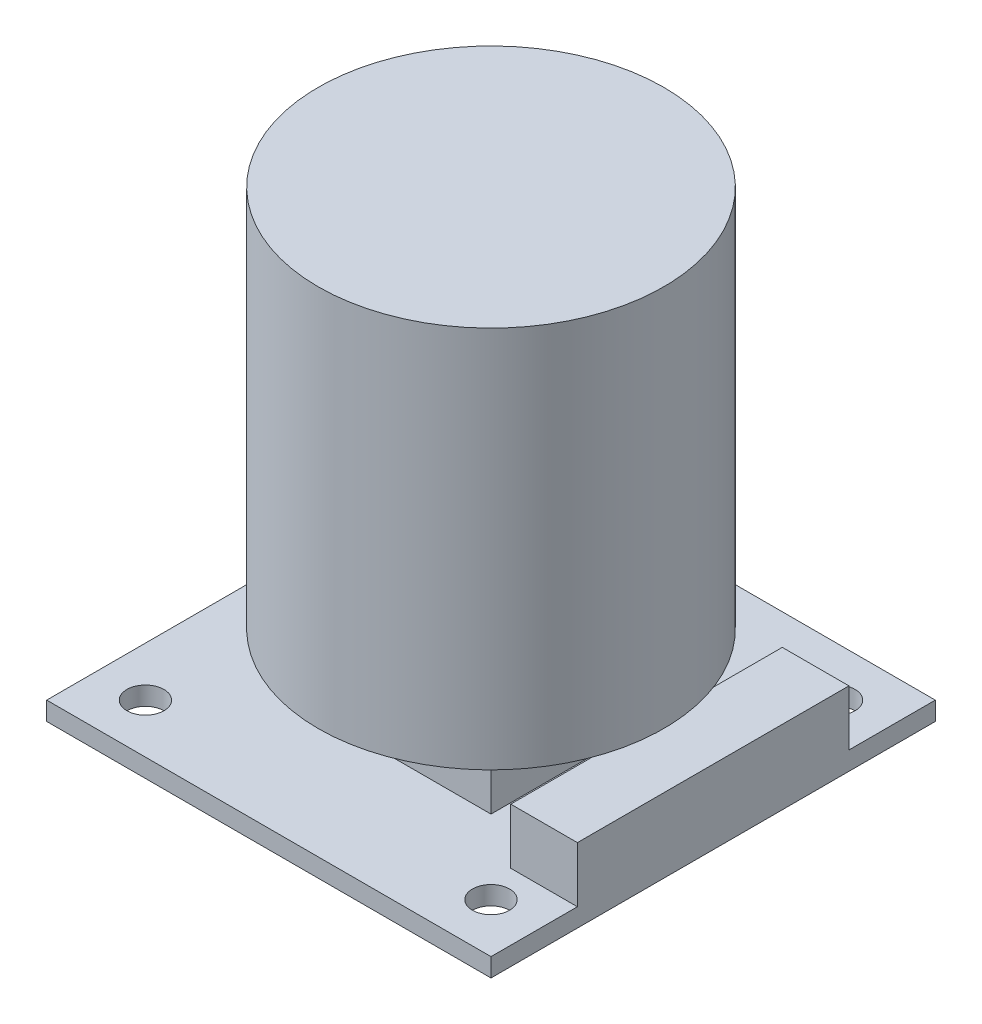
ISO-10303-21;
HEADER;
FILE_DESCRIPTION(('STEP AP214'),'2;1');
FILE_NAME('part.step','',(''),(''),'','','');
FILE_SCHEMA(('AUTOMOTIVE_DESIGN { 1 0 10303 214 1 1 1 1 }'));
ENDSEC;
DATA;
#1=APPLICATION_CONTEXT('core data for automotive mechanical design processes');
#2=APPLICATION_PROTOCOL_DEFINITION('international standard','automotive_design',2000,#1);
#3=PRODUCT_CONTEXT('',#1,'mechanical');
#4=PRODUCT('Part','Part','',(#3));
#5=PRODUCT_RELATED_PRODUCT_CATEGORY('part','',(#4));
#6=PRODUCT_DEFINITION_FORMATION('','',#4);
#7=PRODUCT_DEFINITION_CONTEXT('part definition',#1,'design');
#8=PRODUCT_DEFINITION('design','',#6,#7);
#9=PRODUCT_DEFINITION_SHAPE('','',#8);
#10=(LENGTH_UNIT() NAMED_UNIT(*) SI_UNIT(.MILLI.,.METRE.));
#11=(NAMED_UNIT(*) PLANE_ANGLE_UNIT() SI_UNIT($,.RADIAN.));
#12=(NAMED_UNIT(*) SI_UNIT($,.STERADIAN.) SOLID_ANGLE_UNIT());
#13=UNCERTAINTY_MEASURE_WITH_UNIT(LENGTH_MEASURE(1.E-05),#10,'distance_accuracy_value','');
#14=(GEOMETRIC_REPRESENTATION_CONTEXT(3) GLOBAL_UNCERTAINTY_ASSIGNED_CONTEXT((#13)) GLOBAL_UNIT_ASSIGNED_CONTEXT((#10,
#11,#12)) REPRESENTATION_CONTEXT('',''));
#15=CARTESIAN_POINT('',(0.,0.,0.));
#16=DIRECTION('',(0.,0.,1.));
#17=DIRECTION('',(1.,0.,0.));
#18=AXIS2_PLACEMENT_3D('',#15,#16,#17);
#19=CARTESIAN_POINT('',(0.,1.5,0.));
#20=DIRECTION('',(0.,-1.,0.));
#21=DIRECTION('',(0.,0.,-1.));
#22=AXIS2_PLACEMENT_3D('',#19,#20,#21);
#23=PLANE('',#22);
#24=DIRECTION('',(1.,0.,0.));
#25=VECTOR('',#24,1.);
#26=CARTESIAN_POINT('',(12.6,1.5,11.));
#27=LINE('',#26,#25);
#28=CARTESIAN_POINT('',(12.6,1.5,11.));
#29=VERTEX_POINT('',#28);
#30=CARTESIAN_POINT('',(18.,1.5,11.));
#31=VERTEX_POINT('',#30);
#32=EDGE_CURVE('E186',#29,#31,#27,.T.);
#33=ORIENTED_EDGE('',*,*,#32,.F.);
#34=DIRECTION('',(0.,0.,1.));
#35=VECTOR('',#34,1.);
#36=CARTESIAN_POINT('',(12.6,1.5,11.));
#37=LINE('',#36,#35);
#38=CARTESIAN_POINT('',(12.6,1.5,-11.));
#39=VERTEX_POINT('',#38);
#40=EDGE_CURVE('E199',#39,#29,#37,.T.);
#41=ORIENTED_EDGE('',*,*,#40,.F.);
#42=DIRECTION('',(-1.,0.,0.));
#43=VECTOR('',#42,1.);
#44=CARTESIAN_POINT('',(12.6,1.5,-11.));
#45=LINE('',#44,#43);
#46=CARTESIAN_POINT('',(18.,1.5,-11.));
#47=VERTEX_POINT('',#46);
#48=EDGE_CURVE('E180',#47,#39,#45,.T.);
#49=ORIENTED_EDGE('',*,*,#48,.F.);
#50=DIRECTION('',(0.,0.,-1.));
#51=VECTOR('',#50,1.);
#52=CARTESIAN_POINT('',(18.,1.5,18.));
#53=LINE('',#52,#51);
#54=CARTESIAN_POINT('',(18.,1.5,-18.));
#55=VERTEX_POINT('',#54);
#56=EDGE_CURVE('E258',#47,#55,#53,.T.);
#57=ORIENTED_EDGE('',*,*,#56,.T.);
#58=DIRECTION('',(-1.,0.,0.));
#59=VECTOR('',#58,1.);
#60=CARTESIAN_POINT('',(-18.,1.5,-18.));
#61=LINE('',#60,#59);
#62=CARTESIAN_POINT('',(-18.,1.5,-18.));
#63=VERTEX_POINT('',#62);
#64=EDGE_CURVE('E257',#55,#63,#61,.T.);
#65=ORIENTED_EDGE('',*,*,#64,.T.);
#66=DIRECTION('',(0.,0.,1.));
#67=VECTOR('',#66,1.);
#68=CARTESIAN_POINT('',(-18.,1.5,18.));
#69=LINE('',#68,#67);
#70=CARTESIAN_POINT('',(-18.,1.5,18.));
#71=VERTEX_POINT('',#70);
#72=EDGE_CURVE('E261',#63,#71,#69,.T.);
#73=ORIENTED_EDGE('',*,*,#72,.T.);
#74=DIRECTION('',(1.,0.,0.));
#75=VECTOR('',#74,1.);
#76=CARTESIAN_POINT('',(-18.,1.5,18.));
#77=LINE('',#76,#75);
#78=CARTESIAN_POINT('',(18.,1.5,18.));
#79=VERTEX_POINT('',#78);
#80=EDGE_CURVE('E264',#71,#79,#77,.T.);
#81=ORIENTED_EDGE('',*,*,#80,.T.);
#82=EDGE_CURVE('E254',#79,#31,#53,.T.);
#83=ORIENTED_EDGE('',*,*,#82,.T.);
#84=EDGE_LOOP('',(#33,#41,#49,#57,#65,#73,#81,#83));
#85=FACE_BOUND('',#84,.T.);
#86=CARTESIAN_POINT('',(-14.,1.5,-14.));
#87=DIRECTION('',(0.,1.,0.));
#88=DIRECTION('',(0.,0.,1.));
#89=AXIS2_PLACEMENT_3D('',#86,#87,#88);
#90=CIRCLE('',#89,1.5);
#91=CARTESIAN_POINT('',(-14.,1.5,-12.5));
#92=VERTEX_POINT('',#91);
#93=EDGE_CURVE('E221',#92,#92,#90,.T.);
#94=ORIENTED_EDGE('',*,*,#93,.F.);
#95=EDGE_LOOP('',(#94));
#96=FACE_BOUND('',#95,.T.);
#97=CARTESIAN_POINT('',(-14.,1.5,14.));
#98=DIRECTION('',(0.,1.,0.));
#99=DIRECTION('',(0.,0.,1.));
#100=AXIS2_PLACEMENT_3D('',#97,#98,#99);
#101=CIRCLE('',#100,1.5);
#102=CARTESIAN_POINT('',(-14.,1.5,15.5));
#103=VERTEX_POINT('',#102);
#104=EDGE_CURVE('E235',#103,#103,#101,.T.);
#105=ORIENTED_EDGE('',*,*,#104,.F.);
#106=EDGE_LOOP('',(#105));
#107=FACE_BOUND('',#106,.T.);
#108=CARTESIAN_POINT('',(14.,1.5,14.));
#109=DIRECTION('',(0.,1.,0.));
#110=DIRECTION('',(0.,0.,1.));
#111=AXIS2_PLACEMENT_3D('',#108,#109,#110);
#112=CIRCLE('',#111,1.5);
#113=CARTESIAN_POINT('',(14.,1.5,15.5));
#114=VERTEX_POINT('',#113);
#115=EDGE_CURVE('E227',#114,#114,#112,.T.);
#116=ORIENTED_EDGE('',*,*,#115,.F.);
#117=EDGE_LOOP('',(#116));
#118=FACE_BOUND('',#117,.T.);
#119=CARTESIAN_POINT('',(14.,1.5,-14.));
#120=DIRECTION('',(0.,1.,0.));
#121=DIRECTION('',(0.,0.,1.));
#122=AXIS2_PLACEMENT_3D('',#119,#120,#121);
#123=CIRCLE('',#122,1.5);
#124=CARTESIAN_POINT('',(14.,1.5,-12.5));
#125=VERTEX_POINT('',#124);
#126=EDGE_CURVE('E226',#125,#125,#123,.T.);
#127=ORIENTED_EDGE('',*,*,#126,.F.);
#128=EDGE_LOOP('',(#127));
#129=FACE_BOUND('',#128,.T.);
#130=DIRECTION('',(0.,0.,1.));
#131=VECTOR('',#130,1.);
#132=CARTESIAN_POINT('',(-8.,1.5,8.));
#133=LINE('',#132,#131);
#134=CARTESIAN_POINT('',(-8.,1.5,-8.));
#135=VERTEX_POINT('',#134);
#136=CARTESIAN_POINT('',(-8.,1.5,8.));
#137=VERTEX_POINT('',#136);
#138=EDGE_CURVE('E162',#135,#137,#133,.T.);
#139=ORIENTED_EDGE('',*,*,#138,.F.);
#140=DIRECTION('',(-1.,0.,0.));
#141=VECTOR('',#140,1.);
#142=CARTESIAN_POINT('',(8.,1.5,-8.));
#143=LINE('',#142,#141);
#144=CARTESIAN_POINT('',(8.,1.5,-8.));
#145=VERTEX_POINT('',#144);
#146=EDGE_CURVE('E141',#145,#135,#143,.T.);
#147=ORIENTED_EDGE('',*,*,#146,.F.);
#148=DIRECTION('',(0.,0.,-1.));
#149=VECTOR('',#148,1.);
#150=CARTESIAN_POINT('',(8.,1.5,8.));
#151=LINE('',#150,#149);
#152=CARTESIAN_POINT('',(8.,1.5,8.));
#153=VERTEX_POINT('',#152);
#154=EDGE_CURVE('E62',#153,#145,#151,.T.);
#155=ORIENTED_EDGE('',*,*,#154,.F.);
#156=DIRECTION('',(1.,0.,0.));
#157=VECTOR('',#156,1.);
#158=CARTESIAN_POINT('',(8.,1.5,8.));
#159=LINE('',#158,#157);
#160=EDGE_CURVE('E57',#137,#153,#159,.T.);
#161=ORIENTED_EDGE('',*,*,#160,.F.);
#162=EDGE_LOOP('',(#139,#147,#155,#161));
#163=FACE_BOUND('',#162,.T.);
#164=ADVANCED_FACE('F41',(#85,#96,#107,#118,#129,#163),#23,.F.);
#165=CARTESIAN_POINT('',(18.,1.5,18.));
#166=DIRECTION('',(-1.,0.,0.));
#167=DIRECTION('',(0.,0.,1.));
#168=AXIS2_PLACEMENT_3D('',#165,#166,#167);
#169=PLANE('',#168);
#170=DIRECTION('',(0.,0.,-1.));
#171=VECTOR('',#170,1.);
#172=CARTESIAN_POINT('',(18.,0.,18.));
#173=LINE('',#172,#171);
#174=CARTESIAN_POINT('',(18.,0.,18.));
#175=VERTEX_POINT('',#174);
#176=CARTESIAN_POINT('',(18.,0.,-18.));
#177=VERTEX_POINT('',#176);
#178=EDGE_CURVE('E250',#175,#177,#173,.T.);
#179=ORIENTED_EDGE('',*,*,#178,.T.);
#180=DIRECTION('',(0.,-1.,0.));
#181=VECTOR('',#180,1.);
#182=CARTESIAN_POINT('',(18.,1.5,-18.));
#183=LINE('',#182,#181);
#184=EDGE_CURVE('E11',#55,#177,#183,.T.);
#185=ORIENTED_EDGE('',*,*,#184,.F.);
#186=ORIENTED_EDGE('',*,*,#56,.F.);
#187=DIRECTION('',(0.,-1.,0.));
#188=VECTOR('',#187,1.);
#189=CARTESIAN_POINT('',(18.,6.,-11.));
#190=LINE('',#189,#188);
#191=CARTESIAN_POINT('',(18.,6.,-11.));
#192=VERTEX_POINT('',#191);
#193=EDGE_CURVE('E217',#192,#47,#190,.T.);
#194=ORIENTED_EDGE('',*,*,#193,.F.);
#195=DIRECTION('',(0.,0.,-1.));
#196=VECTOR('',#195,1.);
#197=CARTESIAN_POINT('',(18.,6.,11.));
#198=LINE('',#197,#196);
#199=CARTESIAN_POINT('',(18.,6.,11.));
#200=VERTEX_POINT('',#199);
#201=EDGE_CURVE('E181',#200,#192,#198,.T.);
#202=ORIENTED_EDGE('',*,*,#201,.F.);
#203=DIRECTION('',(0.,-1.,0.));
#204=VECTOR('',#203,1.);
#205=CARTESIAN_POINT('',(18.,6.,11.));
#206=LINE('',#205,#204);
#207=EDGE_CURVE('E195',#200,#31,#206,.T.);
#208=ORIENTED_EDGE('',*,*,#207,.T.);
#209=ORIENTED_EDGE('',*,*,#82,.F.);
#210=DIRECTION('',(0.,-1.,0.));
#211=VECTOR('',#210,1.);
#212=CARTESIAN_POINT('',(18.,1.5,18.));
#213=LINE('',#212,#211);
#214=EDGE_CURVE('E267',#79,#175,#213,.T.);
#215=ORIENTED_EDGE('',*,*,#214,.T.);
#216=EDGE_LOOP('',(#179,#185,#186,#194,#202,#208,#209,#215));
#217=FACE_BOUND('',#216,.T.);
#218=ADVANCED_FACE('F43',(#217),#169,.F.);
#219=CARTESIAN_POINT('',(-18.,1.5,-18.));
#220=DIRECTION('',(0.,0.,1.));
#221=DIRECTION('',(1.,0.,0.));
#222=AXIS2_PLACEMENT_3D('',#219,#220,#221);
#223=PLANE('',#222);
#224=DIRECTION('',(-1.,0.,0.));
#225=VECTOR('',#224,1.);
#226=CARTESIAN_POINT('',(-18.,0.,-18.));
#227=LINE('',#226,#225);
#228=CARTESIAN_POINT('',(-18.,0.,-18.));
#229=VERTEX_POINT('',#228);
#230=EDGE_CURVE('E271',#177,#229,#227,.T.);
#231=ORIENTED_EDGE('',*,*,#230,.T.);
#232=DIRECTION('',(0.,-1.,0.));
#233=VECTOR('',#232,1.);
#234=CARTESIAN_POINT('',(-18.,1.5,-18.));
#235=LINE('',#234,#233);
#236=EDGE_CURVE('E50',#63,#229,#235,.T.);
#237=ORIENTED_EDGE('',*,*,#236,.F.);
#238=ORIENTED_EDGE('',*,*,#64,.F.);
#239=ORIENTED_EDGE('',*,*,#184,.T.);
#240=EDGE_LOOP('',(#231,#237,#238,#239));
#241=FACE_BOUND('',#240,.T.);
#242=ADVANCED_FACE('F324',(#241),#223,.F.);
#243=CARTESIAN_POINT('',(-18.,1.5,18.));
#244=DIRECTION('',(1.,0.,0.));
#245=DIRECTION('',(0.,0.,-1.));
#246=AXIS2_PLACEMENT_3D('',#243,#244,#245);
#247=PLANE('',#246);
#248=DIRECTION('',(0.,0.,1.));
#249=VECTOR('',#248,1.);
#250=CARTESIAN_POINT('',(-18.,0.,18.));
#251=LINE('',#250,#249);
#252=CARTESIAN_POINT('',(-18.,0.,18.));
#253=VERTEX_POINT('',#252);
#254=EDGE_CURVE('E274',#229,#253,#251,.T.);
#255=ORIENTED_EDGE('',*,*,#254,.T.);
#256=DIRECTION('',(0.,-1.,0.));
#257=VECTOR('',#256,1.);
#258=CARTESIAN_POINT('',(-18.,1.5,18.));
#259=LINE('',#258,#257);
#260=EDGE_CURVE('E283',#71,#253,#259,.T.);
#261=ORIENTED_EDGE('',*,*,#260,.F.);
#262=ORIENTED_EDGE('',*,*,#72,.F.);
#263=ORIENTED_EDGE('',*,*,#236,.T.);
#264=EDGE_LOOP('',(#255,#261,#262,#263));
#265=FACE_BOUND('',#264,.T.);
#266=ADVANCED_FACE('F292',(#265),#247,.F.);
#267=CARTESIAN_POINT('',(-18.,1.5,18.));
#268=DIRECTION('',(0.,0.,-1.));
#269=DIRECTION('',(-1.,0.,0.));
#270=AXIS2_PLACEMENT_3D('',#267,#268,#269);
#271=PLANE('',#270);
#272=DIRECTION('',(1.,0.,0.));
#273=VECTOR('',#272,1.);
#274=CARTESIAN_POINT('',(-18.,0.,18.));
#275=LINE('',#274,#273);
#276=EDGE_CURVE('E277',#253,#175,#275,.T.);
#277=ORIENTED_EDGE('',*,*,#276,.T.);
#278=ORIENTED_EDGE('',*,*,#214,.F.);
#279=ORIENTED_EDGE('',*,*,#80,.F.);
#280=ORIENTED_EDGE('',*,*,#260,.T.);
#281=EDGE_LOOP('',(#277,#278,#279,#280));
#282=FACE_BOUND('',#281,.T.);
#283=ADVANCED_FACE('F302',(#282),#271,.F.);
#284=CARTESIAN_POINT('',(0.,0.,0.));
#285=DIRECTION('',(0.,-1.,0.));
#286=DIRECTION('',(0.,0.,-1.));
#287=AXIS2_PLACEMENT_3D('',#284,#285,#286);
#288=PLANE('',#287);
#289=CARTESIAN_POINT('',(-14.,0.,-14.));
#290=DIRECTION('',(0.,1.,0.));
#291=DIRECTION('',(0.,0.,1.));
#292=AXIS2_PLACEMENT_3D('',#289,#290,#291);
#293=CIRCLE('',#292,1.5);
#294=CARTESIAN_POINT('',(-14.,0.,-12.5));
#295=VERTEX_POINT('',#294);
#296=EDGE_CURVE('E239',#295,#295,#293,.T.);
#297=ORIENTED_EDGE('',*,*,#296,.T.);
#298=EDGE_LOOP('',(#297));
#299=FACE_BOUND('',#298,.T.);
#300=CARTESIAN_POINT('',(-14.,0.,14.));
#301=DIRECTION('',(0.,1.,0.));
#302=DIRECTION('',(0.,0.,1.));
#303=AXIS2_PLACEMENT_3D('',#300,#301,#302);
#304=CIRCLE('',#303,1.5);
#305=CARTESIAN_POINT('',(-14.,0.,15.5));
#306=VERTEX_POINT('',#305);
#307=EDGE_CURVE('E231',#306,#306,#304,.T.);
#308=ORIENTED_EDGE('',*,*,#307,.T.);
#309=EDGE_LOOP('',(#308));
#310=FACE_BOUND('',#309,.T.);
#311=CARTESIAN_POINT('',(14.,0.,14.));
#312=DIRECTION('',(0.,1.,0.));
#313=DIRECTION('',(0.,0.,1.));
#314=AXIS2_PLACEMENT_3D('',#311,#312,#313);
#315=CIRCLE('',#314,1.5);
#316=CARTESIAN_POINT('',(14.,0.,15.5));
#317=VERTEX_POINT('',#316);
#318=EDGE_CURVE('E222',#317,#317,#315,.T.);
#319=ORIENTED_EDGE('',*,*,#318,.T.);
#320=EDGE_LOOP('',(#319));
#321=FACE_BOUND('',#320,.T.);
#322=CARTESIAN_POINT('',(14.,0.,-14.));
#323=DIRECTION('',(0.,1.,0.));
#324=DIRECTION('',(0.,0.,1.));
#325=AXIS2_PLACEMENT_3D('',#322,#323,#324);
#326=CIRCLE('',#325,1.5);
#327=CARTESIAN_POINT('',(14.,0.,-12.5));
#328=VERTEX_POINT('',#327);
#329=EDGE_CURVE('E246',#328,#328,#326,.T.);
#330=ORIENTED_EDGE('',*,*,#329,.T.);
#331=EDGE_LOOP('',(#330));
#332=FACE_BOUND('',#331,.T.);
#333=ORIENTED_EDGE('',*,*,#178,.F.);
#334=ORIENTED_EDGE('',*,*,#276,.F.);
#335=ORIENTED_EDGE('',*,*,#254,.F.);
#336=ORIENTED_EDGE('',*,*,#230,.F.);
#337=EDGE_LOOP('',(#333,#334,#335,#336));
#338=FACE_BOUND('',#337,.T.);
#339=ADVANCED_FACE('F299',(#299,#310,#321,#332,#338),#288,.T.);
#340=CARTESIAN_POINT('',(14.,0.,-14.));
#341=DIRECTION('',(0.,1.,0.));
#342=DIRECTION('',(0.,0.,1.));
#343=AXIS2_PLACEMENT_3D('',#340,#341,#342);
#344=CYLINDRICAL_SURFACE('',#343,1.5);
#345=ORIENTED_EDGE('',*,*,#329,.F.);
#346=EDGE_LOOP('',(#345));
#347=FACE_BOUND('',#346,.T.);
#348=ORIENTED_EDGE('',*,*,#126,.T.);
#349=EDGE_LOOP('',(#348));
#350=FACE_BOUND('',#349,.T.);
#351=ADVANCED_FACE('F337',(#347,#350),#344,.F.);
#352=CARTESIAN_POINT('',(14.,0.,14.));
#353=DIRECTION('',(0.,1.,0.));
#354=DIRECTION('',(0.,0.,1.));
#355=AXIS2_PLACEMENT_3D('',#352,#353,#354);
#356=CYLINDRICAL_SURFACE('',#355,1.5);
#357=ORIENTED_EDGE('',*,*,#318,.F.);
#358=EDGE_LOOP('',(#357));
#359=FACE_BOUND('',#358,.T.);
#360=ORIENTED_EDGE('',*,*,#115,.T.);
#361=EDGE_LOOP('',(#360));
#362=FACE_BOUND('',#361,.T.);
#363=ADVANCED_FACE('F357',(#359,#362),#356,.F.);
#364=CARTESIAN_POINT('',(-14.,0.,14.));
#365=DIRECTION('',(0.,1.,0.));
#366=DIRECTION('',(0.,0.,1.));
#367=AXIS2_PLACEMENT_3D('',#364,#365,#366);
#368=CYLINDRICAL_SURFACE('',#367,1.5);
#369=ORIENTED_EDGE('',*,*,#307,.F.);
#370=EDGE_LOOP('',(#369));
#371=FACE_BOUND('',#370,.T.);
#372=ORIENTED_EDGE('',*,*,#104,.T.);
#373=EDGE_LOOP('',(#372));
#374=FACE_BOUND('',#373,.T.);
#375=ADVANCED_FACE('F364',(#371,#374),#368,.F.);
#376=CARTESIAN_POINT('',(-14.,0.,-14.));
#377=DIRECTION('',(0.,1.,0.));
#378=DIRECTION('',(0.,0.,1.));
#379=AXIS2_PLACEMENT_3D('',#376,#377,#378);
#380=CYLINDRICAL_SURFACE('',#379,1.5);
#381=ORIENTED_EDGE('',*,*,#296,.F.);
#382=EDGE_LOOP('',(#381));
#383=FACE_BOUND('',#382,.T.);
#384=ORIENTED_EDGE('',*,*,#93,.T.);
#385=EDGE_LOOP('',(#384));
#386=FACE_BOUND('',#385,.T.);
#387=ADVANCED_FACE('F372',(#383,#386),#380,.F.);
#388=CARTESIAN_POINT('',(12.6,6.,-11.));
#389=DIRECTION('',(0.,0.,1.));
#390=DIRECTION('',(1.,0.,0.));
#391=AXIS2_PLACEMENT_3D('',#388,#389,#390);
#392=PLANE('',#391);
#393=ORIENTED_EDGE('',*,*,#48,.T.);
#394=DIRECTION('',(0.,-1.,0.));
#395=VECTOR('',#394,1.);
#396=CARTESIAN_POINT('',(12.6,6.,-11.));
#397=LINE('',#396,#395);
#398=CARTESIAN_POINT('',(12.6,6.,-11.));
#399=VERTEX_POINT('',#398);
#400=EDGE_CURVE('E213',#399,#39,#397,.T.);
#401=ORIENTED_EDGE('',*,*,#400,.F.);
#402=DIRECTION('',(-1.,0.,0.));
#403=VECTOR('',#402,1.);
#404=CARTESIAN_POINT('',(12.6,6.,-11.));
#405=LINE('',#404,#403);
#406=EDGE_CURVE('E185',#192,#399,#405,.T.);
#407=ORIENTED_EDGE('',*,*,#406,.F.);
#408=ORIENTED_EDGE('',*,*,#193,.T.);
#409=EDGE_LOOP('',(#393,#401,#407,#408));
#410=FACE_BOUND('',#409,.T.);
#411=ADVANCED_FACE('F321',(#410),#392,.F.);
#412=CARTESIAN_POINT('',(12.6,6.,11.));
#413=DIRECTION('',(1.,0.,0.));
#414=DIRECTION('',(0.,0.,-1.));
#415=AXIS2_PLACEMENT_3D('',#412,#413,#414);
#416=PLANE('',#415);
#417=ORIENTED_EDGE('',*,*,#40,.T.);
#418=DIRECTION('',(0.,-1.,0.));
#419=VECTOR('',#418,1.);
#420=CARTESIAN_POINT('',(12.6,6.,11.));
#421=LINE('',#420,#419);
#422=CARTESIAN_POINT('',(12.6,6.,11.));
#423=VERTEX_POINT('',#422);
#424=EDGE_CURVE('E209',#423,#29,#421,.T.);
#425=ORIENTED_EDGE('',*,*,#424,.F.);
#426=DIRECTION('',(0.,0.,1.));
#427=VECTOR('',#426,1.);
#428=CARTESIAN_POINT('',(12.6,6.,11.));
#429=LINE('',#428,#427);
#430=EDGE_CURVE('E189',#399,#423,#429,.T.);
#431=ORIENTED_EDGE('',*,*,#430,.F.);
#432=ORIENTED_EDGE('',*,*,#400,.T.);
#433=EDGE_LOOP('',(#417,#425,#431,#432));
#434=FACE_BOUND('',#433,.T.);
#435=ADVANCED_FACE('F317',(#434),#416,.F.);
#436=CARTESIAN_POINT('',(12.6,6.,11.));
#437=DIRECTION('',(0.,0.,-1.));
#438=DIRECTION('',(-1.,0.,0.));
#439=AXIS2_PLACEMENT_3D('',#436,#437,#438);
#440=PLANE('',#439);
#441=ORIENTED_EDGE('',*,*,#32,.T.);
#442=ORIENTED_EDGE('',*,*,#207,.F.);
#443=DIRECTION('',(1.,0.,0.));
#444=VECTOR('',#443,1.);
#445=CARTESIAN_POINT('',(12.6,6.,11.));
#446=LINE('',#445,#444);
#447=EDGE_CURVE('E192',#423,#200,#446,.T.);
#448=ORIENTED_EDGE('',*,*,#447,.F.);
#449=ORIENTED_EDGE('',*,*,#424,.T.);
#450=EDGE_LOOP('',(#441,#442,#448,#449));
#451=FACE_BOUND('',#450,.T.);
#452=ADVANCED_FACE('F312',(#451),#440,.F.);
#453=CARTESIAN_POINT('',(0.,6.,0.));
#454=DIRECTION('',(0.,-1.,0.));
#455=DIRECTION('',(0.,0.,-1.));
#456=AXIS2_PLACEMENT_3D('',#453,#454,#455);
#457=PLANE('',#456);
#458=ORIENTED_EDGE('',*,*,#201,.T.);
#459=ORIENTED_EDGE('',*,*,#406,.T.);
#460=ORIENTED_EDGE('',*,*,#430,.T.);
#461=ORIENTED_EDGE('',*,*,#447,.T.);
#462=EDGE_LOOP('',(#458,#459,#460,#461));
#463=FACE_BOUND('',#462,.T.);
#464=ADVANCED_FACE('F399',(#463),#457,.F.);
#465=CARTESIAN_POINT('',(-8.,6.5,8.));
#466=DIRECTION('',(1.,0.,0.));
#467=DIRECTION('',(0.,0.,-1.));
#468=AXIS2_PLACEMENT_3D('',#465,#466,#467);
#469=PLANE('',#468);
#470=ORIENTED_EDGE('',*,*,#138,.T.);
#471=DIRECTION('',(0.,-1.,0.));
#472=VECTOR('',#471,1.);
#473=CARTESIAN_POINT('',(-8.,6.5,8.));
#474=LINE('',#473,#472);
#475=CARTESIAN_POINT('',(-8.,6.5,8.));
#476=VERTEX_POINT('',#475);
#477=EDGE_CURVE('E135',#476,#137,#474,.T.);
#478=ORIENTED_EDGE('',*,*,#477,.F.);
#479=DIRECTION('',(0.,0.,1.));
#480=VECTOR('',#479,1.);
#481=CARTESIAN_POINT('',(-8.,6.5,8.));
#482=LINE('',#481,#480);
#483=CARTESIAN_POINT('',(-8.,6.5,-8.));
#484=VERTEX_POINT('',#483);
#485=EDGE_CURVE('E130',#484,#476,#482,.T.);
#486=ORIENTED_EDGE('',*,*,#485,.F.);
#487=DIRECTION('',(0.,-1.,0.));
#488=VECTOR('',#487,1.);
#489=CARTESIAN_POINT('',(-8.,6.5,-8.));
#490=LINE('',#489,#488);
#491=EDGE_CURVE('E134',#484,#135,#490,.T.);
#492=ORIENTED_EDGE('',*,*,#491,.T.);
#493=EDGE_LOOP('',(#470,#478,#486,#492));
#494=FACE_BOUND('',#493,.T.);
#495=ADVANCED_FACE('F133',(#494),#469,.F.);
#496=CARTESIAN_POINT('',(8.,6.5,8.));
#497=DIRECTION('',(0.,0.,-1.));
#498=DIRECTION('',(-1.,0.,0.));
#499=AXIS2_PLACEMENT_3D('',#496,#497,#498);
#500=PLANE('',#499);
#501=ORIENTED_EDGE('',*,*,#160,.T.);
#502=DIRECTION('',(0.,-1.,0.));
#503=VECTOR('',#502,1.);
#504=CARTESIAN_POINT('',(8.,6.5,8.));
#505=LINE('',#504,#503);
#506=CARTESIAN_POINT('',(8.,6.5,8.));
#507=VERTEX_POINT('',#506);
#508=EDGE_CURVE('E174',#507,#153,#505,.T.);
#509=ORIENTED_EDGE('',*,*,#508,.F.);
#510=DIRECTION('',(1.,0.,0.));
#511=VECTOR('',#510,1.);
#512=CARTESIAN_POINT('',(8.,6.5,8.));
#513=LINE('',#512,#511);
#514=EDGE_CURVE('E140',#476,#507,#513,.T.);
#515=ORIENTED_EDGE('',*,*,#514,.F.);
#516=ORIENTED_EDGE('',*,*,#477,.T.);
#517=EDGE_LOOP('',(#501,#509,#515,#516));
#518=FACE_BOUND('',#517,.T.);
#519=ADVANCED_FACE('F413',(#518),#500,.F.);
#520=CARTESIAN_POINT('',(8.,6.5,8.));
#521=DIRECTION('',(-1.,0.,0.));
#522=DIRECTION('',(0.,0.,1.));
#523=AXIS2_PLACEMENT_3D('',#520,#521,#522);
#524=PLANE('',#523);
#525=ORIENTED_EDGE('',*,*,#154,.T.);
#526=DIRECTION('',(0.,-1.,0.));
#527=VECTOR('',#526,1.);
#528=CARTESIAN_POINT('',(8.,6.5,-8.));
#529=LINE('',#528,#527);
#530=CARTESIAN_POINT('',(8.,6.5,-8.));
#531=VERTEX_POINT('',#530);
#532=EDGE_CURVE('E151',#531,#145,#529,.T.);
#533=ORIENTED_EDGE('',*,*,#532,.F.);
#534=DIRECTION('',(0.,0.,-1.));
#535=VECTOR('',#534,1.);
#536=CARTESIAN_POINT('',(8.,6.5,8.));
#537=LINE('',#536,#535);
#538=EDGE_CURVE('E155',#507,#531,#537,.T.);
#539=ORIENTED_EDGE('',*,*,#538,.F.);
#540=ORIENTED_EDGE('',*,*,#508,.T.);
#541=EDGE_LOOP('',(#525,#533,#539,#540));
#542=FACE_BOUND('',#541,.T.);
#543=ADVANCED_FACE('F420',(#542),#524,.F.);
#544=CARTESIAN_POINT('',(8.,6.5,-8.));
#545=DIRECTION('',(0.,0.,1.));
#546=DIRECTION('',(1.,0.,0.));
#547=AXIS2_PLACEMENT_3D('',#544,#545,#546);
#548=PLANE('',#547);
#549=ORIENTED_EDGE('',*,*,#146,.T.);
#550=ORIENTED_EDGE('',*,*,#491,.F.);
#551=DIRECTION('',(-1.,0.,0.));
#552=VECTOR('',#551,1.);
#553=CARTESIAN_POINT('',(8.,6.5,-8.));
#554=LINE('',#553,#552);
#555=EDGE_CURVE('E148',#531,#484,#554,.T.);
#556=ORIENTED_EDGE('',*,*,#555,.F.);
#557=ORIENTED_EDGE('',*,*,#532,.T.);
#558=EDGE_LOOP('',(#549,#550,#556,#557));
#559=FACE_BOUND('',#558,.T.);
#560=ADVANCED_FACE('F146',(#559),#548,.F.);
#561=CARTESIAN_POINT('',(0.,6.5,0.));
#562=DIRECTION('',(0.,1.,0.));
#563=DIRECTION('',(0.,0.,1.));
#564=AXIS2_PLACEMENT_3D('',#561,#562,#563);
#565=PLANE('',#564);
#566=CARTESIAN_POINT('',(0.,6.5,0.));
#567=DIRECTION('',(0.,1.,0.));
#568=DIRECTION('',(0.,0.,1.));
#569=AXIS2_PLACEMENT_3D('',#566,#567,#568);
#570=CIRCLE('',#569,14.);
#571=CARTESIAN_POINT('',(0.,6.5,14.));
#572=VERTEX_POINT('',#571);
#573=EDGE_CURVE('E519',#572,#572,#570,.T.);
#574=ORIENTED_EDGE('',*,*,#573,.F.);
#575=EDGE_LOOP('',(#574));
#576=FACE_BOUND('',#575,.T.);
#577=ORIENTED_EDGE('',*,*,#555,.T.);
#578=ORIENTED_EDGE('',*,*,#485,.T.);
#579=ORIENTED_EDGE('',*,*,#514,.T.);
#580=ORIENTED_EDGE('',*,*,#538,.T.);
#581=EDGE_LOOP('',(#577,#578,#579,#580));
#582=FACE_BOUND('',#581,.T.);
#583=ADVANCED_FACE('F153',(#576,#582),#565,.F.);
#584=CARTESIAN_POINT('',(0.,37.5,0.));
#585=DIRECTION('',(0.,-1.,0.));
#586=DIRECTION('',(0.,0.,-1.));
#587=AXIS2_PLACEMENT_3D('',#584,#585,#586);
#588=CYLINDRICAL_SURFACE('',#587,14.);
#589=CARTESIAN_POINT('',(0.,37.5,0.));
#590=DIRECTION('',(0.,1.,0.));
#591=DIRECTION('',(0.,0.,1.));
#592=AXIS2_PLACEMENT_3D('',#589,#590,#591);
#593=CIRCLE('',#592,14.);
#594=CARTESIAN_POINT('',(0.,37.5,14.));
#595=VERTEX_POINT('',#594);
#596=EDGE_CURVE('E165',#595,#595,#593,.T.);
#597=ORIENTED_EDGE('',*,*,#596,.F.);
#598=EDGE_LOOP('',(#597));
#599=FACE_BOUND('',#598,.T.);
#600=ORIENTED_EDGE('',*,*,#573,.T.);
#601=EDGE_LOOP('',(#600));
#602=FACE_BOUND('',#601,.T.);
#603=ADVANCED_FACE('F441',(#599,#602),#588,.T.);
#604=CARTESIAN_POINT('',(0.,37.5,0.));
#605=DIRECTION('',(0.,1.,0.));
#606=DIRECTION('',(0.,0.,1.));
#607=AXIS2_PLACEMENT_3D('',#604,#605,#606);
#608=PLANE('',#607);
#609=ORIENTED_EDGE('',*,*,#596,.T.);
#610=EDGE_LOOP('',(#609));
#611=FACE_BOUND('',#610,.T.);
#612=ADVANCED_FACE('F449',(#611),#608,.T.);
#613=CLOSED_SHELL('',(#164,#218,#242,#266,#283,#339,#351,#363,#375,#387,#411,#435,#452,#464,
#495,#519,#543,#560,#583,#603,#612));
#614=MANIFOLD_SOLID_BREP('B2',#613);
#615=ADVANCED_BREP_SHAPE_REPRESENTATION('',(#18,#614),#14);
#616=SHAPE_DEFINITION_REPRESENTATION(#9,#615);
ENDSEC;
END-ISO-10303-21;
